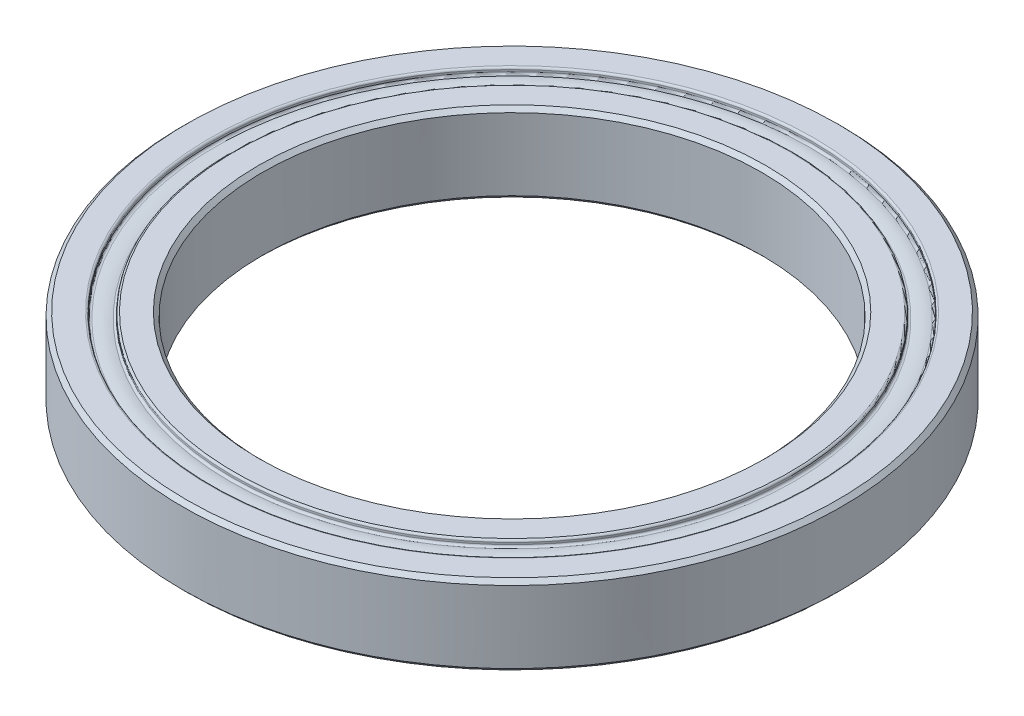
ISO-10303-21;
HEADER;
FILE_DESCRIPTION(('STEP AP214'),'2;1');
FILE_NAME('part.step','',(''),(''),'','','');
FILE_SCHEMA(('AUTOMOTIVE_DESIGN { 1 0 10303 214 1 1 1 1 }'));
ENDSEC;
DATA;
#1=APPLICATION_CONTEXT('core data for automotive mechanical design processes');
#2=APPLICATION_PROTOCOL_DEFINITION('international standard','automotive_design',2000,#1);
#3=PRODUCT_CONTEXT('',#1,'mechanical');
#4=PRODUCT('Part','Part','',(#3));
#5=PRODUCT_RELATED_PRODUCT_CATEGORY('part','',(#4));
#6=PRODUCT_DEFINITION_FORMATION('','',#4);
#7=PRODUCT_DEFINITION_CONTEXT('part definition',#1,'design');
#8=PRODUCT_DEFINITION('design','',#6,#7);
#9=PRODUCT_DEFINITION_SHAPE('','',#8);
#10=(LENGTH_UNIT() NAMED_UNIT(*) SI_UNIT(.MILLI.,.METRE.));
#11=(NAMED_UNIT(*) PLANE_ANGLE_UNIT() SI_UNIT($,.RADIAN.));
#12=(NAMED_UNIT(*) SI_UNIT($,.STERADIAN.) SOLID_ANGLE_UNIT());
#13=UNCERTAINTY_MEASURE_WITH_UNIT(LENGTH_MEASURE(1.E-05),#10,'distance_accuracy_value','');
#14=(GEOMETRIC_REPRESENTATION_CONTEXT(3) GLOBAL_UNCERTAINTY_ASSIGNED_CONTEXT((#13)) GLOBAL_UNIT_ASSIGNED_CONTEXT((#10,
#11,#12)) REPRESENTATION_CONTEXT('',''));
#15=CARTESIAN_POINT('',(0.,0.,0.));
#16=DIRECTION('',(0.,0.,1.));
#17=DIRECTION('',(1.,0.,0.));
#18=AXIS2_PLACEMENT_3D('',#15,#16,#17);
#19=CARTESIAN_POINT('',(-27.8,8.,0.));
#20=DIRECTION('',(0.,-1.,0.));
#21=DIRECTION('',(0.,0.,-1.));
#22=AXIS2_PLACEMENT_3D('',#19,#20,#21);
#23=PLANE('',#22);
#24=CARTESIAN_POINT('',(0.,8.,0.));
#25=DIRECTION('',(0.,-1.,0.));
#26=DIRECTION('',(0.,0.,-1.));
#27=AXIS2_PLACEMENT_3D('',#24,#25,#26);
#28=CIRCLE('',#27,25.4);
#29=CARTESIAN_POINT('',(0.,8.,-25.4));
#30=VERTEX_POINT('',#29);
#31=EDGE_CURVE('E57',#30,#30,#28,.T.);
#32=ORIENTED_EDGE('',*,*,#31,.T.);
#33=EDGE_LOOP('',(#32));
#34=FACE_BOUND('',#33,.T.);
#35=CARTESIAN_POINT('',(0.,8.00000000000001,0.));
#36=DIRECTION('',(0.,-1.,0.));
#37=DIRECTION('',(0.,0.,-1.));
#38=AXIS2_PLACEMENT_3D('',#35,#36,#37);
#39=CIRCLE('',#38,27.8);
#40=CARTESIAN_POINT('',(0.,8.00000000000001,-27.8));
#41=VERTEX_POINT('',#40);
#42=EDGE_CURVE('E114',#41,#41,#39,.T.);
#43=ORIENTED_EDGE('',*,*,#42,.F.);
#44=EDGE_LOOP('',(#43));
#45=FACE_BOUND('',#44,.T.);
#46=ADVANCED_FACE('F37',(#34,#45),#23,.F.);
#47=CARTESIAN_POINT('',(0.,0.,0.));
#48=DIRECTION('',(0.,-1.,0.));
#49=DIRECTION('',(0.,0.,-1.));
#50=AXIS2_PLACEMENT_3D('',#47,#48,#49);
#51=CYLINDRICAL_SURFACE('',#50,25.);
#52=CARTESIAN_POINT('',(0.,7.60000000000001,0.));
#53=DIRECTION('',(0.,-1.,0.));
#54=DIRECTION('',(0.,0.,-1.));
#55=AXIS2_PLACEMENT_3D('',#52,#53,#54);
#56=CIRCLE('',#55,25.);
#57=CARTESIAN_POINT('',(0.,7.60000000000001,-25.));
#58=VERTEX_POINT('',#57);
#59=EDGE_CURVE('E48',#58,#58,#56,.F.);
#60=ORIENTED_EDGE('',*,*,#59,.T.);
#61=EDGE_LOOP('',(#60));
#62=FACE_BOUND('',#61,.T.);
#63=CARTESIAN_POINT('',(0.,0.399999999999978,0.));
#64=DIRECTION('',(0.,1.,0.));
#65=DIRECTION('',(0.,0.,1.));
#66=AXIS2_PLACEMENT_3D('',#63,#64,#65);
#67=CIRCLE('',#66,25.);
#68=CARTESIAN_POINT('',(0.,0.399999999999978,25.));
#69=VERTEX_POINT('',#68);
#70=EDGE_CURVE('E52',#69,#69,#67,.F.);
#71=ORIENTED_EDGE('',*,*,#70,.T.);
#72=EDGE_LOOP('',(#71));
#73=FACE_BOUND('',#72,.T.);
#74=ADVANCED_FACE('F121',(#62,#73),#51,.F.);
#75=CARTESIAN_POINT('',(-25.,0.,0.));
#76=DIRECTION('',(0.,1.,0.));
#77=DIRECTION('',(0.,0.,1.));
#78=AXIS2_PLACEMENT_3D('',#75,#76,#77);
#79=PLANE('',#78);
#80=CARTESIAN_POINT('',(0.,0.,0.));
#81=DIRECTION('',(0.,1.,0.));
#82=DIRECTION('',(0.,0.,1.));
#83=AXIS2_PLACEMENT_3D('',#80,#81,#82);
#84=CIRCLE('',#83,25.4);
#85=CARTESIAN_POINT('',(0.,0.,25.4));
#86=VERTEX_POINT('',#85);
#87=EDGE_CURVE('E44',#86,#86,#84,.T.);
#88=ORIENTED_EDGE('',*,*,#87,.T.);
#89=EDGE_LOOP('',(#88));
#90=FACE_BOUND('',#89,.T.);
#91=CARTESIAN_POINT('',(0.,0.,0.));
#92=DIRECTION('',(0.,-1.,0.));
#93=DIRECTION('',(0.,0.,-1.));
#94=AXIS2_PLACEMENT_3D('',#91,#92,#93);
#95=CIRCLE('',#94,27.8);
#96=CARTESIAN_POINT('',(0.,0.,-27.8));
#97=VERTEX_POINT('',#96);
#98=EDGE_CURVE('E69',#97,#97,#95,.T.);
#99=ORIENTED_EDGE('',*,*,#98,.T.);
#100=EDGE_LOOP('',(#99));
#101=FACE_BOUND('',#100,.T.);
#102=ADVANCED_FACE('F128',(#90,#101),#79,.F.);
#103=CARTESIAN_POINT('',(0.,0.2,0.));
#104=DIRECTION('',(0.,-1.,0.));
#105=DIRECTION('',(0.,0.,-1.));
#106=AXIS2_PLACEMENT_3D('',#103,#104,#105);
#107=TOROIDAL_SURFACE('',#106,27.8,0.2);
#108=ORIENTED_EDGE('',*,*,#98,.F.);
#109=EDGE_LOOP('',(#108));
#110=FACE_BOUND('',#109,.T.);
#111=CARTESIAN_POINT('',(0.,0.2,0.));
#112=DIRECTION('',(0.,-1.,0.));
#113=DIRECTION('',(0.,0.,-1.));
#114=AXIS2_PLACEMENT_3D('',#111,#112,#113);
#115=CIRCLE('',#114,28.);
#116=CARTESIAN_POINT('',(0.,0.2,-28.));
#117=VERTEX_POINT('',#116);
#118=EDGE_CURVE('E72',#117,#117,#115,.T.);
#119=ORIENTED_EDGE('',*,*,#118,.T.);
#120=EDGE_LOOP('',(#119));
#121=FACE_BOUND('',#120,.T.);
#122=ADVANCED_FACE('F194',(#110,#121),#107,.T.);
#123=CARTESIAN_POINT('',(0.,0.,0.));
#124=DIRECTION('',(0.,-1.,0.));
#125=DIRECTION('',(0.,0.,-1.));
#126=AXIS2_PLACEMENT_3D('',#123,#124,#125);
#127=CYLINDRICAL_SURFACE('',#126,28.);
#128=ORIENTED_EDGE('',*,*,#118,.F.);
#129=EDGE_LOOP('',(#128));
#130=FACE_BOUND('',#129,.T.);
#131=CARTESIAN_POINT('',(0.,0.387521626362308,0.));
#132=DIRECTION('',(0.,-1.,0.));
#133=DIRECTION('',(0.,0.,-1.));
#134=AXIS2_PLACEMENT_3D('',#131,#132,#133);
#135=CIRCLE('',#134,28.);
#136=CARTESIAN_POINT('',(0.,0.387521626362308,-28.));
#137=VERTEX_POINT('',#136);
#138=EDGE_CURVE('E75',#137,#137,#135,.T.);
#139=ORIENTED_EDGE('',*,*,#138,.T.);
#140=EDGE_LOOP('',(#139));
#141=FACE_BOUND('',#140,.T.);
#142=ADVANCED_FACE('F190',(#130,#141),#127,.T.);
#143=CARTESIAN_POINT('',(0.,0.387521626362308,0.));
#144=DIRECTION('',(0.,-1.,0.));
#145=DIRECTION('',(0.,0.,-1.));
#146=AXIS2_PLACEMENT_3D('',#143,#144,#145);
#147=TOROIDAL_SURFACE('',#146,28.2,0.200000000000001);
#148=ORIENTED_EDGE('',*,*,#138,.F.);
#149=EDGE_LOOP('',(#148));
#150=FACE_BOUND('',#149,.T.);
#151=CARTESIAN_POINT('',(0.,0.582790727640021,0.));
#152=DIRECTION('',(0.,-1.,0.));
#153=DIRECTION('',(0.,0.,-1.));
#154=AXIS2_PLACEMENT_3D('',#151,#152,#153);
#155=CIRCLE('',#154,28.2432432432433);
#156=CARTESIAN_POINT('',(0.,0.582790727640021,-28.2432432432433));
#157=VERTEX_POINT('',#156);
#158=EDGE_CURVE('E78',#157,#157,#155,.T.);
#159=ORIENTED_EDGE('',*,*,#158,.T.);
#160=EDGE_LOOP('',(#159));
#161=FACE_BOUND('',#160,.T.);
#162=ADVANCED_FACE('F186',(#150,#161),#147,.F.);
#163=CARTESIAN_POINT('',(0.,4.,0.));
#164=DIRECTION('',(0.,-1.,0.));
#165=DIRECTION('',(0.,0.,-1.));
#166=AXIS2_PLACEMENT_3D('',#163,#164,#165);
#167=TOROIDAL_SURFACE('',#166,29.,3.5);
#168=ORIENTED_EDGE('',*,*,#158,.F.);
#169=EDGE_LOOP('',(#168));
#170=FACE_BOUND('',#169,.T.);
#171=CARTESIAN_POINT('',(0.,0.582790727640023,0.));
#172=DIRECTION('',(0.,-1.,0.));
#173=DIRECTION('',(0.,0.,-1.));
#174=AXIS2_PLACEMENT_3D('',#171,#172,#173);
#175=CIRCLE('',#174,29.7567567567568);
#176=CARTESIAN_POINT('',(0.,0.582790727640023,-29.7567567567568));
#177=VERTEX_POINT('',#176);
#178=EDGE_CURVE('E81',#177,#177,#175,.T.);
#179=ORIENTED_EDGE('',*,*,#178,.T.);
#180=EDGE_LOOP('',(#179));
#181=FACE_BOUND('',#180,.T.);
#182=ADVANCED_FACE('F182',(#170,#181),#167,.T.);
#183=CARTESIAN_POINT('',(0.,0.387521626362311,0.));
#184=DIRECTION('',(0.,-1.,0.));
#185=DIRECTION('',(0.,0.,-1.));
#186=AXIS2_PLACEMENT_3D('',#183,#184,#185);
#187=TOROIDAL_SURFACE('',#186,29.8,0.199999999999996);
#188=ORIENTED_EDGE('',*,*,#178,.F.);
#189=EDGE_LOOP('',(#188));
#190=FACE_BOUND('',#189,.T.);
#191=CARTESIAN_POINT('',(0.,0.387521626362311,0.));
#192=DIRECTION('',(0.,-1.,0.));
#193=DIRECTION('',(0.,0.,-1.));
#194=AXIS2_PLACEMENT_3D('',#191,#192,#193);
#195=CIRCLE('',#194,30.);
#196=CARTESIAN_POINT('',(0.,0.387521626362311,-30.));
#197=VERTEX_POINT('',#196);
#198=EDGE_CURVE('E84',#197,#197,#195,.T.);
#199=ORIENTED_EDGE('',*,*,#198,.T.);
#200=EDGE_LOOP('',(#199));
#201=FACE_BOUND('',#200,.T.);
#202=ADVANCED_FACE('F178',(#190,#201),#187,.F.);
#203=CARTESIAN_POINT('',(0.,0.,0.));
#204=DIRECTION('',(0.,-1.,0.));
#205=DIRECTION('',(0.,0.,-1.));
#206=AXIS2_PLACEMENT_3D('',#203,#204,#205);
#207=CYLINDRICAL_SURFACE('',#206,30.);
#208=ORIENTED_EDGE('',*,*,#198,.F.);
#209=EDGE_LOOP('',(#208));
#210=FACE_BOUND('',#209,.T.);
#211=CARTESIAN_POINT('',(0.,0.199999999999999,0.));
#212=DIRECTION('',(0.,-1.,0.));
#213=DIRECTION('',(0.,0.,-1.));
#214=AXIS2_PLACEMENT_3D('',#211,#212,#213);
#215=CIRCLE('',#214,30.);
#216=CARTESIAN_POINT('',(0.,0.199999999999999,-30.));
#217=VERTEX_POINT('',#216);
#218=EDGE_CURVE('E87',#217,#217,#215,.T.);
#219=ORIENTED_EDGE('',*,*,#218,.T.);
#220=EDGE_LOOP('',(#219));
#221=FACE_BOUND('',#220,.T.);
#222=ADVANCED_FACE('F174',(#210,#221),#207,.F.);
#223=CARTESIAN_POINT('',(0.,0.199999999999999,0.));
#224=DIRECTION('',(0.,-1.,0.));
#225=DIRECTION('',(0.,0.,-1.));
#226=AXIS2_PLACEMENT_3D('',#223,#224,#225);
#227=TOROIDAL_SURFACE('',#226,30.2,0.2);
#228=ORIENTED_EDGE('',*,*,#218,.F.);
#229=EDGE_LOOP('',(#228));
#230=FACE_BOUND('',#229,.T.);
#231=CARTESIAN_POINT('',(0.,0.,0.));
#232=DIRECTION('',(0.,-1.,0.));
#233=DIRECTION('',(0.,0.,-1.));
#234=AXIS2_PLACEMENT_3D('',#231,#232,#233);
#235=CIRCLE('',#234,30.2);
#236=CARTESIAN_POINT('',(0.,0.,-30.2));
#237=VERTEX_POINT('',#236);
#238=EDGE_CURVE('E90',#237,#237,#235,.T.);
#239=ORIENTED_EDGE('',*,*,#238,.T.);
#240=EDGE_LOOP('',(#239));
#241=FACE_BOUND('',#240,.T.);
#242=ADVANCED_FACE('F168',(#230,#241),#227,.T.);
#243=CARTESIAN_POINT('',(-30.2,0.,0.));
#244=DIRECTION('',(0.,1.,0.));
#245=DIRECTION('',(0.,0.,1.));
#246=AXIS2_PLACEMENT_3D('',#243,#244,#245);
#247=PLANE('',#246);
#248=CARTESIAN_POINT('',(0.,0.,0.));
#249=DIRECTION('',(0.,1.,0.));
#250=DIRECTION('',(0.,0.,1.));
#251=AXIS2_PLACEMENT_3D('',#248,#249,#250);
#252=CIRCLE('',#251,32.6);
#253=CARTESIAN_POINT('',(0.,0.,32.6));
#254=VERTEX_POINT('',#253);
#255=EDGE_CURVE('E10',#254,#254,#252,.F.);
#256=ORIENTED_EDGE('',*,*,#255,.T.);
#257=EDGE_LOOP('',(#256));
#258=FACE_BOUND('',#257,.T.);
#259=ORIENTED_EDGE('',*,*,#238,.F.);
#260=EDGE_LOOP('',(#259));
#261=FACE_BOUND('',#260,.T.);
#262=ADVANCED_FACE('F158',(#258,#261),#247,.F.);
#263=CARTESIAN_POINT('',(0.,0.,0.));
#264=DIRECTION('',(0.,-1.,0.));
#265=DIRECTION('',(0.,0.,-1.));
#266=AXIS2_PLACEMENT_3D('',#263,#264,#265);
#267=CYLINDRICAL_SURFACE('',#266,33.);
#268=CARTESIAN_POINT('',(0.,7.60000000000001,0.));
#269=DIRECTION('',(0.,-1.,0.));
#270=DIRECTION('',(0.,0.,-1.));
#271=AXIS2_PLACEMENT_3D('',#268,#269,#270);
#272=CIRCLE('',#271,33.);
#273=CARTESIAN_POINT('',(0.,7.60000000000001,-33.));
#274=VERTEX_POINT('',#273);
#275=EDGE_CURVE('E63',#274,#274,#272,.T.);
#276=ORIENTED_EDGE('',*,*,#275,.T.);
#277=EDGE_LOOP('',(#276));
#278=FACE_BOUND('',#277,.T.);
#279=CARTESIAN_POINT('',(0.,0.400000000000015,0.));
#280=DIRECTION('',(0.,1.,0.));
#281=DIRECTION('',(0.,0.,1.));
#282=AXIS2_PLACEMENT_3D('',#279,#280,#281);
#283=CIRCLE('',#282,33.);
#284=CARTESIAN_POINT('',(0.,0.400000000000015,33.));
#285=VERTEX_POINT('',#284);
#286=EDGE_CURVE('E66',#285,#285,#283,.T.);
#287=ORIENTED_EDGE('',*,*,#286,.T.);
#288=EDGE_LOOP('',(#287));
#289=FACE_BOUND('',#288,.T.);
#290=ADVANCED_FACE('F155',(#278,#289),#267,.T.);
#291=CARTESIAN_POINT('',(-33.,8.00000000000001,0.));
#292=DIRECTION('',(0.,-1.,0.));
#293=DIRECTION('',(0.,0.,-1.));
#294=AXIS2_PLACEMENT_3D('',#291,#292,#293);
#295=PLANE('',#294);
#296=CARTESIAN_POINT('',(0.,8.00000000000001,0.));
#297=DIRECTION('',(0.,-1.,0.));
#298=DIRECTION('',(0.,0.,-1.));
#299=AXIS2_PLACEMENT_3D('',#296,#297,#298);
#300=CIRCLE('',#299,32.6);
#301=CARTESIAN_POINT('',(0.,8.00000000000001,-32.6));
#302=VERTEX_POINT('',#301);
#303=EDGE_CURVE('E60',#302,#302,#300,.F.);
#304=ORIENTED_EDGE('',*,*,#303,.T.);
#305=EDGE_LOOP('',(#304));
#306=FACE_BOUND('',#305,.T.);
#307=CARTESIAN_POINT('',(0.,8.00000000000001,0.));
#308=DIRECTION('',(0.,-1.,0.));
#309=DIRECTION('',(0.,0.,-1.));
#310=AXIS2_PLACEMENT_3D('',#307,#308,#309);
#311=CIRCLE('',#310,30.2);
#312=CARTESIAN_POINT('',(0.,8.00000000000001,-30.2));
#313=VERTEX_POINT('',#312);
#314=EDGE_CURVE('E93',#313,#313,#311,.T.);
#315=ORIENTED_EDGE('',*,*,#314,.T.);
#316=EDGE_LOOP('',(#315));
#317=FACE_BOUND('',#316,.T.);
#318=ADVANCED_FACE('F157',(#306,#317),#295,.F.);
#319=CARTESIAN_POINT('',(0.,7.80000000000001,0.));
#320=DIRECTION('',(0.,-1.,0.));
#321=DIRECTION('',(0.,0.,-1.));
#322=AXIS2_PLACEMENT_3D('',#319,#320,#321);
#323=TOROIDAL_SURFACE('',#322,30.2,0.2);
#324=ORIENTED_EDGE('',*,*,#314,.F.);
#325=EDGE_LOOP('',(#324));
#326=FACE_BOUND('',#325,.T.);
#327=CARTESIAN_POINT('',(0.,7.80000000000001,0.));
#328=DIRECTION('',(0.,-1.,0.));
#329=DIRECTION('',(0.,0.,-1.));
#330=AXIS2_PLACEMENT_3D('',#327,#328,#329);
#331=CIRCLE('',#330,30.);
#332=CARTESIAN_POINT('',(0.,7.80000000000001,-30.));
#333=VERTEX_POINT('',#332);
#334=EDGE_CURVE('E96',#333,#333,#331,.T.);
#335=ORIENTED_EDGE('',*,*,#334,.T.);
#336=EDGE_LOOP('',(#335));
#337=FACE_BOUND('',#336,.T.);
#338=ADVANCED_FACE('F165',(#326,#337),#323,.T.);
#339=CARTESIAN_POINT('',(0.,0.,0.));
#340=DIRECTION('',(0.,-1.,0.));
#341=DIRECTION('',(0.,0.,-1.));
#342=AXIS2_PLACEMENT_3D('',#339,#340,#341);
#343=CYLINDRICAL_SURFACE('',#342,30.);
#344=ORIENTED_EDGE('',*,*,#334,.F.);
#345=EDGE_LOOP('',(#344));
#346=FACE_BOUND('',#345,.T.);
#347=CARTESIAN_POINT('',(0.,7.61247837363769,0.));
#348=DIRECTION('',(0.,-1.,0.));
#349=DIRECTION('',(0.,0.,-1.));
#350=AXIS2_PLACEMENT_3D('',#347,#348,#349);
#351=CIRCLE('',#350,30.);
#352=CARTESIAN_POINT('',(0.,7.61247837363769,-30.));
#353=VERTEX_POINT('',#352);
#354=EDGE_CURVE('E99',#353,#353,#351,.T.);
#355=ORIENTED_EDGE('',*,*,#354,.T.);
#356=EDGE_LOOP('',(#355));
#357=FACE_BOUND('',#356,.T.);
#358=ADVANCED_FACE('F242',(#346,#357),#343,.F.);
#359=CARTESIAN_POINT('',(0.,7.61247837363769,0.));
#360=DIRECTION('',(0.,-1.,0.));
#361=DIRECTION('',(0.,0.,-1.));
#362=AXIS2_PLACEMENT_3D('',#359,#360,#361);
#363=TOROIDAL_SURFACE('',#362,29.8,0.2);
#364=ORIENTED_EDGE('',*,*,#354,.F.);
#365=EDGE_LOOP('',(#364));
#366=FACE_BOUND('',#365,.T.);
#367=CARTESIAN_POINT('',(0.,7.41720927235997,0.));
#368=DIRECTION('',(0.,-1.,0.));
#369=DIRECTION('',(0.,0.,-1.));
#370=AXIS2_PLACEMENT_3D('',#367,#368,#369);
#371=CIRCLE('',#370,29.7567567567568);
#372=CARTESIAN_POINT('',(0.,7.41720927235997,-29.7567567567568));
#373=VERTEX_POINT('',#372);
#374=EDGE_CURVE('E102',#373,#373,#371,.T.);
#375=ORIENTED_EDGE('',*,*,#374,.T.);
#376=EDGE_LOOP('',(#375));
#377=FACE_BOUND('',#376,.T.);
#378=ADVANCED_FACE('F249',(#366,#377),#363,.F.);
#379=CARTESIAN_POINT('',(0.,4.,0.));
#380=DIRECTION('',(0.,-1.,0.));
#381=DIRECTION('',(0.,0.,-1.));
#382=AXIS2_PLACEMENT_3D('',#379,#380,#381);
#383=TOROIDAL_SURFACE('',#382,29.,3.5);
#384=ORIENTED_EDGE('',*,*,#374,.F.);
#385=EDGE_LOOP('',(#384));
#386=FACE_BOUND('',#385,.T.);
#387=CARTESIAN_POINT('',(0.,7.41720927235998,0.));
#388=DIRECTION('',(0.,-1.,0.));
#389=DIRECTION('',(0.,0.,-1.));
#390=AXIS2_PLACEMENT_3D('',#387,#388,#389);
#391=CIRCLE('',#390,28.2432432432432);
#392=CARTESIAN_POINT('',(0.,7.41720927235998,-28.2432432432432));
#393=VERTEX_POINT('',#392);
#394=EDGE_CURVE('E105',#393,#393,#391,.T.);
#395=ORIENTED_EDGE('',*,*,#394,.T.);
#396=EDGE_LOOP('',(#395));
#397=FACE_BOUND('',#396,.T.);
#398=ADVANCED_FACE('F257',(#386,#397),#383,.T.);
#399=CARTESIAN_POINT('',(0.,7.61247837363769,0.));
#400=DIRECTION('',(0.,-1.,0.));
#401=DIRECTION('',(0.,0.,-1.));
#402=AXIS2_PLACEMENT_3D('',#399,#400,#401);
#403=TOROIDAL_SURFACE('',#402,28.2,0.199999999999999);
#404=ORIENTED_EDGE('',*,*,#394,.F.);
#405=EDGE_LOOP('',(#404));
#406=FACE_BOUND('',#405,.T.);
#407=CARTESIAN_POINT('',(0.,7.61247837363769,0.));
#408=DIRECTION('',(0.,-1.,0.));
#409=DIRECTION('',(0.,0.,-1.));
#410=AXIS2_PLACEMENT_3D('',#407,#408,#409);
#411=CIRCLE('',#410,28.);
#412=CARTESIAN_POINT('',(0.,7.61247837363769,-28.));
#413=VERTEX_POINT('',#412);
#414=EDGE_CURVE('E108',#413,#413,#411,.T.);
#415=ORIENTED_EDGE('',*,*,#414,.T.);
#416=EDGE_LOOP('',(#415));
#417=FACE_BOUND('',#416,.T.);
#418=ADVANCED_FACE('F265',(#406,#417),#403,.F.);
#419=CARTESIAN_POINT('',(0.,0.,0.));
#420=DIRECTION('',(0.,-1.,0.));
#421=DIRECTION('',(0.,0.,-1.));
#422=AXIS2_PLACEMENT_3D('',#419,#420,#421);
#423=CYLINDRICAL_SURFACE('',#422,28.);
#424=ORIENTED_EDGE('',*,*,#414,.F.);
#425=EDGE_LOOP('',(#424));
#426=FACE_BOUND('',#425,.T.);
#427=CARTESIAN_POINT('',(0.,7.80000000000001,0.));
#428=DIRECTION('',(0.,-1.,0.));
#429=DIRECTION('',(0.,0.,-1.));
#430=AXIS2_PLACEMENT_3D('',#427,#428,#429);
#431=CIRCLE('',#430,28.);
#432=CARTESIAN_POINT('',(0.,7.80000000000001,-28.));
#433=VERTEX_POINT('',#432);
#434=EDGE_CURVE('E111',#433,#433,#431,.T.);
#435=ORIENTED_EDGE('',*,*,#434,.T.);
#436=EDGE_LOOP('',(#435));
#437=FACE_BOUND('',#436,.T.);
#438=ADVANCED_FACE('F273',(#426,#437),#423,.T.);
#439=CARTESIAN_POINT('',(0.,7.80000000000001,0.));
#440=DIRECTION('',(0.,-1.,0.));
#441=DIRECTION('',(0.,0.,-1.));
#442=AXIS2_PLACEMENT_3D('',#439,#440,#441);
#443=TOROIDAL_SURFACE('',#442,27.8,0.2);
#444=ORIENTED_EDGE('',*,*,#434,.F.);
#445=EDGE_LOOP('',(#444));
#446=FACE_BOUND('',#445,.T.);
#447=ORIENTED_EDGE('',*,*,#42,.T.);
#448=EDGE_LOOP('',(#447));
#449=FACE_BOUND('',#448,.T.);
#450=ADVANCED_FACE('F118',(#446,#449),#443,.T.);
#451=CARTESIAN_POINT('',(0.,7.60000000000001,0.));
#452=DIRECTION('',(0.,-1.,0.));
#453=DIRECTION('',(0.,0.,-1.));
#454=AXIS2_PLACEMENT_3D('',#451,#452,#453);
#455=CONICAL_SURFACE('',#454,33.,0.785398163397457);
#456=ORIENTED_EDGE('',*,*,#303,.F.);
#457=EDGE_LOOP('',(#456));
#458=FACE_BOUND('',#457,.T.);
#459=ORIENTED_EDGE('',*,*,#275,.F.);
#460=EDGE_LOOP('',(#459));
#461=FACE_BOUND('',#460,.T.);
#462=ADVANCED_FACE('F133',(#458,#461),#455,.T.);
#463=CARTESIAN_POINT('',(0.,8.,0.));
#464=DIRECTION('',(0.,1.,0.));
#465=DIRECTION('',(0.,0.,1.));
#466=AXIS2_PLACEMENT_3D('',#463,#464,#465);
#467=CONICAL_SURFACE('',#466,25.4,0.785398163397453);
#468=ORIENTED_EDGE('',*,*,#59,.F.);
#469=EDGE_LOOP('',(#468));
#470=FACE_BOUND('',#469,.T.);
#471=ORIENTED_EDGE('',*,*,#31,.F.);
#472=EDGE_LOOP('',(#471));
#473=FACE_BOUND('',#472,.T.);
#474=ADVANCED_FACE('F136',(#470,#473),#467,.F.);
#475=CARTESIAN_POINT('',(0.,0.399999999999978,0.));
#476=DIRECTION('',(0.,-1.,0.));
#477=DIRECTION('',(0.,0.,-1.));
#478=AXIS2_PLACEMENT_3D('',#475,#476,#477);
#479=CONICAL_SURFACE('',#478,25.,0.785398163397461);
#480=ORIENTED_EDGE('',*,*,#87,.F.);
#481=EDGE_LOOP('',(#480));
#482=FACE_BOUND('',#481,.T.);
#483=ORIENTED_EDGE('',*,*,#70,.F.);
#484=EDGE_LOOP('',(#483));
#485=FACE_BOUND('',#484,.T.);
#486=ADVANCED_FACE('F139',(#482,#485),#479,.F.);
#487=CARTESIAN_POINT('',(0.,0.,0.));
#488=DIRECTION('',(0.,1.,0.));
#489=DIRECTION('',(0.,0.,1.));
#490=AXIS2_PLACEMENT_3D('',#487,#488,#489);
#491=CONICAL_SURFACE('',#490,32.6,0.785398163397448);
#492=ORIENTED_EDGE('',*,*,#286,.F.);
#493=EDGE_LOOP('',(#492));
#494=FACE_BOUND('',#493,.T.);
#495=ORIENTED_EDGE('',*,*,#255,.F.);
#496=EDGE_LOOP('',(#495));
#497=FACE_BOUND('',#496,.T.);
#498=ADVANCED_FACE('F39',(#494,#497),#491,.T.);
#499=CLOSED_SHELL('',(#46,#74,#102,#122,#142,#162,#182,#202,#222,#242,#262,#290,#318,#338,#358,
#378,#398,#418,#438,#450,#462,#474,#486,#498));
#500=MANIFOLD_SOLID_BREP('B2',#499);
#501=ADVANCED_BREP_SHAPE_REPRESENTATION('',(#18,#500),#14);
#502=SHAPE_DEFINITION_REPRESENTATION(#9,#501);
ENDSEC;
END-ISO-10303-21;
